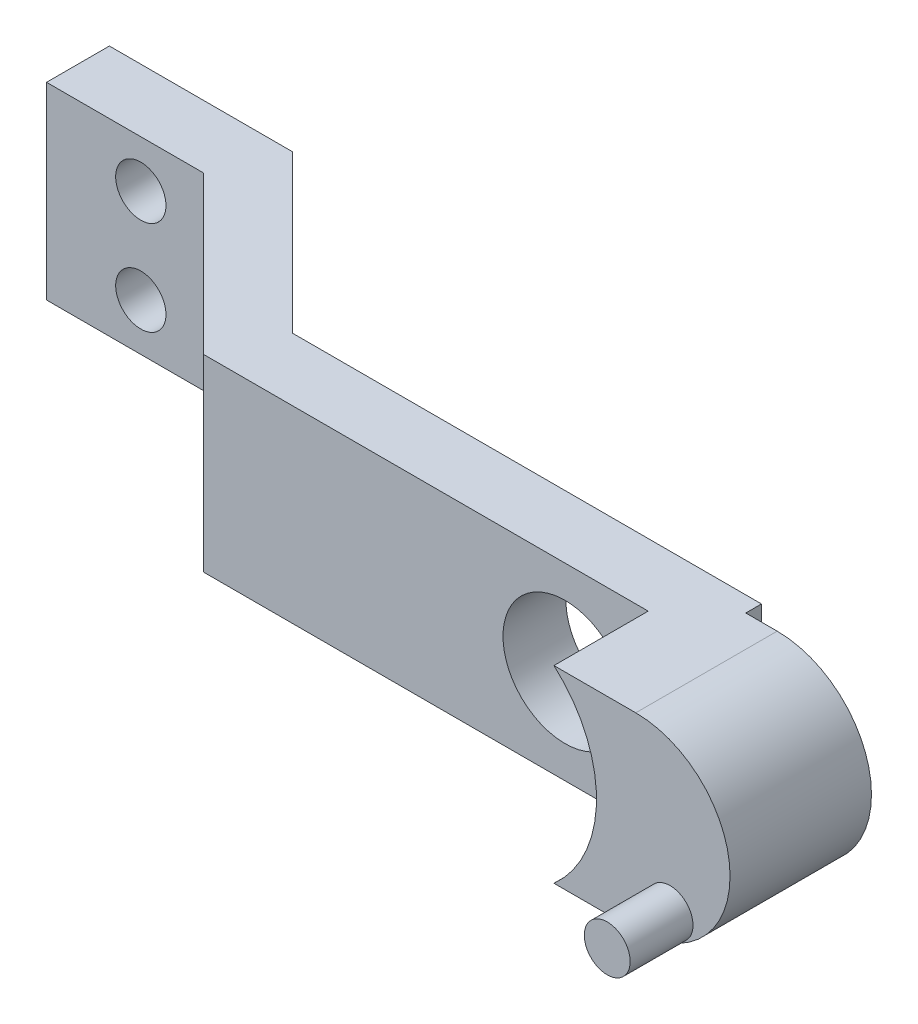
ISO-10303-21;
HEADER;
FILE_DESCRIPTION(('STEP AP214'),'2;1');
FILE_NAME('part.step','',(''),(''),'','','');
FILE_SCHEMA(('AUTOMOTIVE_DESIGN { 1 0 10303 214 1 1 1 1 }'));
ENDSEC;
DATA;
#1=APPLICATION_CONTEXT('core data for automotive mechanical design processes');
#2=APPLICATION_PROTOCOL_DEFINITION('international standard','automotive_design',2000,#1);
#3=PRODUCT_CONTEXT('',#1,'mechanical');
#4=PRODUCT('Part','Part','',(#3));
#5=PRODUCT_RELATED_PRODUCT_CATEGORY('part','',(#4));
#6=PRODUCT_DEFINITION_FORMATION('','',#4);
#7=PRODUCT_DEFINITION_CONTEXT('part definition',#1,'design');
#8=PRODUCT_DEFINITION('design','',#6,#7);
#9=PRODUCT_DEFINITION_SHAPE('','',#8);
#10=(LENGTH_UNIT() NAMED_UNIT(*) SI_UNIT(.MILLI.,.METRE.));
#11=(NAMED_UNIT(*) PLANE_ANGLE_UNIT() SI_UNIT($,.RADIAN.));
#12=(NAMED_UNIT(*) SI_UNIT($,.STERADIAN.) SOLID_ANGLE_UNIT());
#13=UNCERTAINTY_MEASURE_WITH_UNIT(LENGTH_MEASURE(1.E-05),#10,'distance_accuracy_value','');
#14=(GEOMETRIC_REPRESENTATION_CONTEXT(3) GLOBAL_UNCERTAINTY_ASSIGNED_CONTEXT((#13)) GLOBAL_UNIT_ASSIGNED_CONTEXT((#10,
#11,#12)) REPRESENTATION_CONTEXT('',''));
#15=CARTESIAN_POINT('',(0.,0.,0.));
#16=DIRECTION('',(0.,0.,1.));
#17=DIRECTION('',(1.,0.,0.));
#18=AXIS2_PLACEMENT_3D('',#15,#16,#17);
#19=CARTESIAN_POINT('',(0.,0.,4.));
#20=DIRECTION('',(0.,0.,1.));
#21=DIRECTION('',(1.,0.,0.));
#22=AXIS2_PLACEMENT_3D('',#19,#20,#21);
#23=PLANE('',#22);
#24=CARTESIAN_POINT('',(0.,0.,4.));
#25=DIRECTION('',(0.,0.,1.));
#26=DIRECTION('',(1.,0.,0.));
#27=AXIS2_PLACEMENT_3D('',#24,#25,#26);
#28=CIRCLE('',#27,3.95);
#29=CARTESIAN_POINT('',(3.95,0.,4.));
#30=VERTEX_POINT('',#29);
#31=EDGE_CURVE('E175',#30,#30,#28,.T.);
#32=ORIENTED_EDGE('',*,*,#31,.F.);
#33=EDGE_LOOP('',(#32));
#34=FACE_BOUND('',#33,.T.);
#35=CARTESIAN_POINT('',(0.,0.,4.));
#36=DIRECTION('',(0.,0.,-1.));
#37=DIRECTION('',(-1.,0.,0.));
#38=AXIS2_PLACEMENT_3D('',#35,#36,#37);
#39=CIRCLE('',#38,8.);
#40=CARTESIAN_POINT('',(5.29150262212918,6.,4.));
#41=VERTEX_POINT('',#40);
#42=CARTESIAN_POINT('',(5.29150262212918,-6.,4.));
#43=VERTEX_POINT('',#42);
#44=EDGE_CURVE('E69',#41,#43,#39,.T.);
#45=ORIENTED_EDGE('',*,*,#44,.F.);
#46=DIRECTION('',(-1.,0.,0.));
#47=VECTOR('',#46,1.);
#48=CARTESIAN_POINT('',(-23.,5.99999999999999,4.));
#49=LINE('',#48,#47);
#50=CARTESIAN_POINT('',(-23.,5.99999999999999,4.));
#51=VERTEX_POINT('',#50);
#52=EDGE_CURVE('E183',#41,#51,#49,.T.);
#53=ORIENTED_EDGE('',*,*,#52,.T.);
#54=DIRECTION('',(0.,-1.,0.));
#55=VECTOR('',#54,1.);
#56=CARTESIAN_POINT('',(-23.,5.99999999999999,4.));
#57=LINE('',#56,#55);
#58=CARTESIAN_POINT('',(-23.,-6.,4.));
#59=VERTEX_POINT('',#58);
#60=EDGE_CURVE('E167',#51,#59,#57,.T.);
#61=ORIENTED_EDGE('',*,*,#60,.T.);
#62=DIRECTION('',(1.,0.,0.));
#63=VECTOR('',#62,1.);
#64=CARTESIAN_POINT('',(-23.,-6.,4.));
#65=LINE('',#64,#63);
#66=EDGE_CURVE('E173',#59,#43,#65,.T.);
#67=ORIENTED_EDGE('',*,*,#66,.T.);
#68=EDGE_LOOP('',(#45,#53,#61,#67));
#69=FACE_BOUND('',#68,.T.);
#70=ADVANCED_FACE('F45',(#34,#69),#23,.T.);
#71=CARTESIAN_POINT('',(0.,0.,0.));
#72=DIRECTION('',(0.,0.,1.));
#73=DIRECTION('',(1.,0.,0.));
#74=AXIS2_PLACEMENT_3D('',#71,#72,#73);
#75=PLANE('',#74);
#76=DIRECTION('',(-1.,0.,0.));
#77=VECTOR('',#76,1.);
#78=CARTESIAN_POINT('',(-23.,5.99999999999999,0.));
#79=LINE('',#78,#77);
#80=CARTESIAN_POINT('',(8.5,6.,0.));
#81=VERTEX_POINT('',#80);
#82=CARTESIAN_POINT('',(-21.3431457505076,5.99999999999999,0.));
#83=VERTEX_POINT('',#82);
#84=EDGE_CURVE('E155',#81,#83,#79,.T.);
#85=ORIENTED_EDGE('',*,*,#84,.F.);
#86=DIRECTION('',(0.,-1.,0.));
#87=VECTOR('',#86,1.);
#88=CARTESIAN_POINT('',(8.5,6.,0.));
#89=LINE('',#88,#87);
#90=CARTESIAN_POINT('',(8.5,-6.,0.));
#91=VERTEX_POINT('',#90);
#92=EDGE_CURVE('E140',#81,#91,#89,.T.);
#93=ORIENTED_EDGE('',*,*,#92,.T.);
#94=DIRECTION('',(1.,0.,0.));
#95=VECTOR('',#94,1.);
#96=CARTESIAN_POINT('',(-23.,-6.,0.));
#97=LINE('',#96,#95);
#98=CARTESIAN_POINT('',(-21.3431457505076,-6.,0.));
#99=VERTEX_POINT('',#98);
#100=EDGE_CURVE('E168',#99,#91,#97,.T.);
#101=ORIENTED_EDGE('',*,*,#100,.F.);
#102=DIRECTION('',(0.,-1.,0.));
#103=VECTOR('',#102,1.);
#104=CARTESIAN_POINT('',(-21.3431457505076,31.7879688223744,0.));
#105=LINE('',#104,#103);
#106=EDGE_CURVE('E164',#83,#99,#105,.T.);
#107=ORIENTED_EDGE('',*,*,#106,.F.);
#108=EDGE_LOOP('',(#85,#93,#101,#107));
#109=FACE_BOUND('',#108,.T.);
#110=CARTESIAN_POINT('',(0.,0.,0.));
#111=DIRECTION('',(0.,0.,1.));
#112=DIRECTION('',(1.,0.,0.));
#113=AXIS2_PLACEMENT_3D('',#110,#111,#112);
#114=CIRCLE('',#113,3.95);
#115=CARTESIAN_POINT('',(3.95,0.,0.));
#116=VERTEX_POINT('',#115);
#117=EDGE_CURVE('E297',#116,#116,#114,.T.);
#118=ORIENTED_EDGE('',*,*,#117,.T.);
#119=EDGE_LOOP('',(#118));
#120=FACE_BOUND('',#119,.T.);
#121=ADVANCED_FACE('F161',(#109,#120),#75,.F.);
#122=CARTESIAN_POINT('',(-23.,-6.,4.));
#123=DIRECTION('',(0.,1.,0.));
#124=DIRECTION('',(0.,0.,1.));
#125=AXIS2_PLACEMENT_3D('',#122,#123,#124);
#126=PLANE('',#125);
#127=ORIENTED_EDGE('',*,*,#100,.T.);
#128=DIRECTION('',(0.,0.,-1.));
#129=VECTOR('',#128,1.);
#130=CARTESIAN_POINT('',(8.5,-6.,1.));
#131=LINE('',#130,#129);
#132=CARTESIAN_POINT('',(8.5,-6.,1.));
#133=VERTEX_POINT('',#132);
#134=EDGE_CURVE('E146',#133,#91,#131,.T.);
#135=ORIENTED_EDGE('',*,*,#134,.F.);
#136=DIRECTION('',(-1.,0.,0.));
#137=VECTOR('',#136,1.);
#138=CARTESIAN_POINT('',(8.5,-6.,1.));
#139=LINE('',#138,#137);
#140=CARTESIAN_POINT('',(10.5,-6.,1.));
#141=VERTEX_POINT('',#140);
#142=EDGE_CURVE('E159',#141,#133,#139,.T.);
#143=ORIENTED_EDGE('',*,*,#142,.F.);
#144=DIRECTION('',(0.,0.,-1.));
#145=VECTOR('',#144,1.);
#146=CARTESIAN_POINT('',(10.5,-6.,4.));
#147=LINE('',#146,#145);
#148=CARTESIAN_POINT('',(10.5000000000001,-6.,10.));
#149=VERTEX_POINT('',#148);
#150=EDGE_CURVE('E182',#141,#149,#147,.F.);
#151=ORIENTED_EDGE('',*,*,#150,.T.);
#152=DIRECTION('',(1.,0.,0.));
#153=VECTOR('',#152,1.);
#154=CARTESIAN_POINT('',(5.29150262212918,-6.,10.));
#155=LINE('',#154,#153);
#156=CARTESIAN_POINT('',(5.29150262212918,-6.,10.));
#157=VERTEX_POINT('',#156);
#158=EDGE_CURVE('E210',#157,#149,#155,.T.);
#159=ORIENTED_EDGE('',*,*,#158,.F.);
#160=DIRECTION('',(0.,0.,-1.));
#161=VECTOR('',#160,1.);
#162=CARTESIAN_POINT('',(5.29150262212918,-6.,10.));
#163=LINE('',#162,#161);
#164=EDGE_CURVE('E217',#157,#43,#163,.T.);
#165=ORIENTED_EDGE('',*,*,#164,.T.);
#166=ORIENTED_EDGE('',*,*,#66,.F.);
#167=DIRECTION('',(-0.707106781186546,0.,-0.707106781186549));
#168=VECTOR('',#167,1.);
#169=CARTESIAN_POINT('',(-23.,-6.,4.));
#170=LINE('',#169,#168);
#171=CARTESIAN_POINT('',(-33.,-6.,-6.));
#172=VERTEX_POINT('',#171);
#173=EDGE_CURVE('E236',#59,#172,#170,.T.);
#174=ORIENTED_EDGE('',*,*,#173,.T.);
#175=DIRECTION('',(-1.,0.,0.));
#176=VECTOR('',#175,1.);
#177=CARTESIAN_POINT('',(-33.,-6.,-6.));
#178=LINE('',#177,#176);
#179=CARTESIAN_POINT('',(-43.,-6.,-6.));
#180=VERTEX_POINT('',#179);
#181=EDGE_CURVE('E264',#172,#180,#178,.T.);
#182=ORIENTED_EDGE('',*,*,#181,.T.);
#183=DIRECTION('',(0.,0.,-1.));
#184=VECTOR('',#183,1.);
#185=CARTESIAN_POINT('',(-43.,-6.,-6.));
#186=LINE('',#185,#184);
#187=CARTESIAN_POINT('',(-43.,-6.,-10.));
#188=VERTEX_POINT('',#187);
#189=EDGE_CURVE('E268',#180,#188,#186,.T.);
#190=ORIENTED_EDGE('',*,*,#189,.T.);
#191=DIRECTION('',(1.,0.,0.));
#192=VECTOR('',#191,1.);
#193=CARTESIAN_POINT('',(-43.,-6.,-10.));
#194=LINE('',#193,#192);
#195=CARTESIAN_POINT('',(-31.3431457505076,-6.,-10.));
#196=VERTEX_POINT('',#195);
#197=EDGE_CURVE('E272',#188,#196,#194,.T.);
#198=ORIENTED_EDGE('',*,*,#197,.T.);
#199=DIRECTION('',(0.707106781186546,0.,0.707106781186549));
#200=VECTOR('',#199,1.);
#201=CARTESIAN_POINT('',(-31.3431457505076,-6.,-10.));
#202=LINE('',#201,#200);
#203=EDGE_CURVE('E276',#196,#99,#202,.T.);
#204=ORIENTED_EDGE('',*,*,#203,.T.);
#205=EDGE_LOOP('',(#127,#135,#143,#151,#159,#165,#166,#174,#182,#190,#198,#204));
#206=FACE_BOUND('',#205,.T.);
#207=ADVANCED_FACE('F208',(#206),#126,.F.);
#208=CARTESIAN_POINT('',(-23.,5.99999999999999,4.));
#209=DIRECTION('',(0.,-1.,0.));
#210=DIRECTION('',(1.,0.,0.));
#211=AXIS2_PLACEMENT_3D('',#208,#209,#210);
#212=PLANE('',#211);
#213=DIRECTION('',(-1.,0.,0.));
#214=VECTOR('',#213,1.);
#215=CARTESIAN_POINT('',(8.5,6.,1.));
#216=LINE('',#215,#214);
#217=CARTESIAN_POINT('',(10.5,6.,1.));
#218=VERTEX_POINT('',#217);
#219=CARTESIAN_POINT('',(8.5,6.,1.));
#220=VERTEX_POINT('',#219);
#221=EDGE_CURVE('E61',#218,#220,#216,.T.);
#222=ORIENTED_EDGE('',*,*,#221,.T.);
#223=DIRECTION('',(0.,0.,-1.));
#224=VECTOR('',#223,1.);
#225=CARTESIAN_POINT('',(8.5,6.,1.));
#226=LINE('',#225,#224);
#227=EDGE_CURVE('E144',#220,#81,#226,.T.);
#228=ORIENTED_EDGE('',*,*,#227,.T.);
#229=ORIENTED_EDGE('',*,*,#84,.T.);
#230=DIRECTION('',(-0.707106781186546,0.,-0.707106781186549));
#231=VECTOR('',#230,1.);
#232=CARTESIAN_POINT('',(-31.3431457505076,5.99999999999999,-10.));
#233=LINE('',#232,#231);
#234=CARTESIAN_POINT('',(-31.3431457505076,5.99999999999999,-10.));
#235=VERTEX_POINT('',#234);
#236=EDGE_CURVE('E257',#83,#235,#233,.T.);
#237=ORIENTED_EDGE('',*,*,#236,.T.);
#238=DIRECTION('',(-1.,0.,0.));
#239=VECTOR('',#238,1.);
#240=CARTESIAN_POINT('',(-43.,5.99999999999999,-10.));
#241=LINE('',#240,#239);
#242=CARTESIAN_POINT('',(-43.,5.99999999999999,-10.));
#243=VERTEX_POINT('',#242);
#244=EDGE_CURVE('E254',#235,#243,#241,.T.);
#245=ORIENTED_EDGE('',*,*,#244,.T.);
#246=DIRECTION('',(0.,0.,1.));
#247=VECTOR('',#246,1.);
#248=CARTESIAN_POINT('',(-43.,5.99999999999999,-6.));
#249=LINE('',#248,#247);
#250=CARTESIAN_POINT('',(-43.,5.99999999999999,-6.));
#251=VERTEX_POINT('',#250);
#252=EDGE_CURVE('E251',#243,#251,#249,.T.);
#253=ORIENTED_EDGE('',*,*,#252,.T.);
#254=DIRECTION('',(1.,0.,0.));
#255=VECTOR('',#254,1.);
#256=CARTESIAN_POINT('',(-33.,5.99999999999999,-6.));
#257=LINE('',#256,#255);
#258=CARTESIAN_POINT('',(-33.,5.99999999999999,-6.));
#259=VERTEX_POINT('',#258);
#260=EDGE_CURVE('E248',#251,#259,#257,.T.);
#261=ORIENTED_EDGE('',*,*,#260,.T.);
#262=DIRECTION('',(0.707106781186546,0.,0.707106781186549));
#263=VECTOR('',#262,1.);
#264=CARTESIAN_POINT('',(-23.,5.99999999999999,4.));
#265=LINE('',#264,#263);
#266=EDGE_CURVE('E260',#259,#51,#265,.T.);
#267=ORIENTED_EDGE('',*,*,#266,.T.);
#268=ORIENTED_EDGE('',*,*,#52,.F.);
#269=DIRECTION('',(0.,0.,-1.));
#270=VECTOR('',#269,1.);
#271=CARTESIAN_POINT('',(5.29150262212918,6.,10.));
#272=LINE('',#271,#270);
#273=CARTESIAN_POINT('',(5.29150262212918,6.,10.));
#274=VERTEX_POINT('',#273);
#275=EDGE_CURVE('E191',#274,#41,#272,.T.);
#276=ORIENTED_EDGE('',*,*,#275,.F.);
#277=DIRECTION('',(-1.,0.,0.));
#278=VECTOR('',#277,1.);
#279=CARTESIAN_POINT('',(10.5,6.,10.));
#280=LINE('',#279,#278);
#281=CARTESIAN_POINT('',(10.5,6.,10.));
#282=VERTEX_POINT('',#281);
#283=EDGE_CURVE('E222',#282,#274,#280,.T.);
#284=ORIENTED_EDGE('',*,*,#283,.F.);
#285=DIRECTION('',(0.,0.,-1.));
#286=VECTOR('',#285,1.);
#287=CARTESIAN_POINT('',(10.5,6.,4.));
#288=LINE('',#287,#286);
#289=EDGE_CURVE('E179',#282,#218,#288,.T.);
#290=ORIENTED_EDGE('',*,*,#289,.T.);
#291=EDGE_LOOP('',(#222,#228,#229,#237,#245,#253,#261,#267,#268,#276,#284,#290));
#292=FACE_BOUND('',#291,.T.);
#293=ADVANCED_FACE('F154',(#292),#212,.F.);
#294=CARTESIAN_POINT('',(0.,0.,4.));
#295=DIRECTION('',(0.,0.,-1.));
#296=DIRECTION('',(-1.,0.,0.));
#297=AXIS2_PLACEMENT_3D('',#294,#295,#296);
#298=CYLINDRICAL_SURFACE('',#297,3.95);
#299=ORIENTED_EDGE('',*,*,#31,.T.);
#300=EDGE_LOOP('',(#299));
#301=FACE_BOUND('',#300,.T.);
#302=ORIENTED_EDGE('',*,*,#117,.F.);
#303=EDGE_LOOP('',(#302));
#304=FACE_BOUND('',#303,.T.);
#305=ADVANCED_FACE('F373',(#301,#304),#298,.F.);
#306=CARTESIAN_POINT('',(-31.3431457505076,31.7879688223744,-10.));
#307=DIRECTION('',(0.707106781186549,0.,-0.707106781186546));
#308=DIRECTION('',(-0.707106781186546,0.,-0.707106781186549));
#309=AXIS2_PLACEMENT_3D('',#306,#307,#308);
#310=PLANE('',#309);
#311=ORIENTED_EDGE('',*,*,#236,.F.);
#312=ORIENTED_EDGE('',*,*,#106,.T.);
#313=ORIENTED_EDGE('',*,*,#203,.F.);
#314=DIRECTION('',(0.,-1.,0.));
#315=VECTOR('',#314,1.);
#316=CARTESIAN_POINT('',(-31.3431457505076,31.7879688223744,-10.));
#317=LINE('',#316,#315);
#318=EDGE_CURVE('E283',#235,#196,#317,.T.);
#319=ORIENTED_EDGE('',*,*,#318,.F.);
#320=EDGE_LOOP('',(#311,#312,#313,#319));
#321=FACE_BOUND('',#320,.T.);
#322=ADVANCED_FACE('F334',(#321),#310,.T.);
#323=CARTESIAN_POINT('',(-43.,31.7879688223744,-10.));
#324=DIRECTION('',(0.,0.,-1.));
#325=DIRECTION('',(-1.,0.,0.));
#326=AXIS2_PLACEMENT_3D('',#323,#324,#325);
#327=PLANE('',#326);
#328=CARTESIAN_POINT('',(-37.,2.99999999999999,-10.));
#329=DIRECTION('',(0.,0.,1.));
#330=DIRECTION('',(1.,0.,0.));
#331=AXIS2_PLACEMENT_3D('',#328,#329,#330);
#332=CIRCLE('',#331,1.6);
#333=CARTESIAN_POINT('',(-35.4,2.99999999999999,-10.));
#334=VERTEX_POINT('',#333);
#335=EDGE_CURVE('E232',#334,#334,#332,.T.);
#336=ORIENTED_EDGE('',*,*,#335,.T.);
#337=EDGE_LOOP('',(#336));
#338=FACE_BOUND('',#337,.T.);
#339=CARTESIAN_POINT('',(-37.,-3.00000000000001,-10.));
#340=DIRECTION('',(0.,0.,1.));
#341=DIRECTION('',(1.,0.,0.));
#342=AXIS2_PLACEMENT_3D('',#339,#340,#341);
#343=CIRCLE('',#342,1.6);
#344=CARTESIAN_POINT('',(-35.4,-3.00000000000001,-10.));
#345=VERTEX_POINT('',#344);
#346=EDGE_CURVE('E190',#345,#345,#343,.T.);
#347=ORIENTED_EDGE('',*,*,#346,.T.);
#348=EDGE_LOOP('',(#347));
#349=FACE_BOUND('',#348,.T.);
#350=ORIENTED_EDGE('',*,*,#244,.F.);
#351=ORIENTED_EDGE('',*,*,#318,.T.);
#352=ORIENTED_EDGE('',*,*,#197,.F.);
#353=DIRECTION('',(0.,-1.,0.));
#354=VECTOR('',#353,1.);
#355=CARTESIAN_POINT('',(-43.,31.7879688223744,-10.));
#356=LINE('',#355,#354);
#357=EDGE_CURVE('E286',#243,#188,#356,.T.);
#358=ORIENTED_EDGE('',*,*,#357,.F.);
#359=EDGE_LOOP('',(#350,#351,#352,#358));
#360=FACE_BOUND('',#359,.T.);
#361=ADVANCED_FACE('F340',(#338,#349,#360),#327,.T.);
#362=CARTESIAN_POINT('',(-43.,31.7879688223744,-6.));
#363=DIRECTION('',(-1.,0.,0.));
#364=DIRECTION('',(0.,0.,1.));
#365=AXIS2_PLACEMENT_3D('',#362,#363,#364);
#366=PLANE('',#365);
#367=ORIENTED_EDGE('',*,*,#252,.F.);
#368=ORIENTED_EDGE('',*,*,#357,.T.);
#369=ORIENTED_EDGE('',*,*,#189,.F.);
#370=DIRECTION('',(0.,-1.,0.));
#371=VECTOR('',#370,1.);
#372=CARTESIAN_POINT('',(-43.,31.7879688223744,-6.));
#373=LINE('',#372,#371);
#374=EDGE_CURVE('E289',#251,#180,#373,.T.);
#375=ORIENTED_EDGE('',*,*,#374,.F.);
#376=EDGE_LOOP('',(#367,#368,#369,#375));
#377=FACE_BOUND('',#376,.T.);
#378=ADVANCED_FACE('F344',(#377),#366,.T.);
#379=CARTESIAN_POINT('',(-33.,31.7879688223744,-6.));
#380=DIRECTION('',(0.,0.,1.));
#381=DIRECTION('',(1.,0.,0.));
#382=AXIS2_PLACEMENT_3D('',#379,#380,#381);
#383=PLANE('',#382);
#384=CARTESIAN_POINT('',(-37.,2.99999999999999,-6.));
#385=DIRECTION('',(0.,0.,1.));
#386=DIRECTION('',(1.,0.,0.));
#387=AXIS2_PLACEMENT_3D('',#384,#385,#386);
#388=CIRCLE('',#387,1.6);
#389=CARTESIAN_POINT('',(-35.4,2.99999999999999,-6.));
#390=VERTEX_POINT('',#389);
#391=EDGE_CURVE('E237',#390,#390,#388,.T.);
#392=ORIENTED_EDGE('',*,*,#391,.F.);
#393=EDGE_LOOP('',(#392));
#394=FACE_BOUND('',#393,.T.);
#395=CARTESIAN_POINT('',(-37.,-3.00000000000001,-6.));
#396=DIRECTION('',(0.,0.,1.));
#397=DIRECTION('',(1.,0.,0.));
#398=AXIS2_PLACEMENT_3D('',#395,#396,#397);
#399=CIRCLE('',#398,1.6);
#400=CARTESIAN_POINT('',(-35.4,-3.00000000000001,-6.));
#401=VERTEX_POINT('',#400);
#402=EDGE_CURVE('E241',#401,#401,#399,.T.);
#403=ORIENTED_EDGE('',*,*,#402,.F.);
#404=EDGE_LOOP('',(#403));
#405=FACE_BOUND('',#404,.T.);
#406=ORIENTED_EDGE('',*,*,#260,.F.);
#407=ORIENTED_EDGE('',*,*,#374,.T.);
#408=ORIENTED_EDGE('',*,*,#181,.F.);
#409=DIRECTION('',(0.,-1.,0.));
#410=VECTOR('',#409,1.);
#411=CARTESIAN_POINT('',(-33.,31.7879688223744,-6.));
#412=LINE('',#411,#410);
#413=EDGE_CURVE('E280',#259,#172,#412,.T.);
#414=ORIENTED_EDGE('',*,*,#413,.F.);
#415=EDGE_LOOP('',(#406,#407,#408,#414));
#416=FACE_BOUND('',#415,.T.);
#417=ADVANCED_FACE('F347',(#394,#405,#416),#383,.T.);
#418=CARTESIAN_POINT('',(-23.,31.7879688223744,4.));
#419=DIRECTION('',(-0.707106781186549,0.,0.707106781186546));
#420=DIRECTION('',(0.707106781186546,0.,0.707106781186549));
#421=AXIS2_PLACEMENT_3D('',#418,#419,#420);
#422=PLANE('',#421);
#423=ORIENTED_EDGE('',*,*,#266,.F.);
#424=ORIENTED_EDGE('',*,*,#413,.T.);
#425=ORIENTED_EDGE('',*,*,#173,.F.);
#426=ORIENTED_EDGE('',*,*,#60,.F.);
#427=EDGE_LOOP('',(#423,#424,#425,#426));
#428=FACE_BOUND('',#427,.T.);
#429=ADVANCED_FACE('F313',(#428),#422,.T.);
#430=CARTESIAN_POINT('',(-37.,-3.00000000000001,-10.));
#431=DIRECTION('',(0.,0.,1.));
#432=DIRECTION('',(1.,0.,0.));
#433=AXIS2_PLACEMENT_3D('',#430,#431,#432);
#434=CYLINDRICAL_SURFACE('',#433,1.6);
#435=ORIENTED_EDGE('',*,*,#346,.F.);
#436=EDGE_LOOP('',(#435));
#437=FACE_BOUND('',#436,.T.);
#438=ORIENTED_EDGE('',*,*,#402,.T.);
#439=EDGE_LOOP('',(#438));
#440=FACE_BOUND('',#439,.T.);
#441=ADVANCED_FACE('F356',(#437,#440),#434,.F.);
#442=CARTESIAN_POINT('',(-37.,2.99999999999999,-10.));
#443=DIRECTION('',(0.,0.,1.));
#444=DIRECTION('',(1.,0.,0.));
#445=AXIS2_PLACEMENT_3D('',#442,#443,#444);
#446=CYLINDRICAL_SURFACE('',#445,1.6);
#447=ORIENTED_EDGE('',*,*,#335,.F.);
#448=EDGE_LOOP('',(#447));
#449=FACE_BOUND('',#448,.T.);
#450=ORIENTED_EDGE('',*,*,#391,.T.);
#451=EDGE_LOOP('',(#450));
#452=FACE_BOUND('',#451,.T.);
#453=ADVANCED_FACE('F395',(#449,#452),#446,.F.);
#454=CARTESIAN_POINT('',(10.5,0.,4.));
#455=DIRECTION('',(0.,0.,-1.));
#456=DIRECTION('',(-1.,0.,0.));
#457=AXIS2_PLACEMENT_3D('',#454,#455,#456);
#458=CYLINDRICAL_SURFACE('',#457,6.);
#459=CARTESIAN_POINT('',(10.5,0.,1.));
#460=DIRECTION('',(0.,0.,1.));
#461=DIRECTION('',(1.,0.,0.));
#462=AXIS2_PLACEMENT_3D('',#459,#460,#461);
#463=CIRCLE('',#462,6.);
#464=CARTESIAN_POINT('',(16.5,0.,1.));
#465=VERTEX_POINT('',#464);
#466=EDGE_CURVE('E11',#465,#141,#463,.F.);
#467=ORIENTED_EDGE('',*,*,#466,.F.);
#468=DIRECTION('',(0.,0.,-1.));
#469=VECTOR('',#468,1.);
#470=CARTESIAN_POINT('',(16.5,0.,4.));
#471=LINE('',#470,#469);
#472=CARTESIAN_POINT('',(16.5,0.,4.));
#473=VERTEX_POINT('',#472);
#474=EDGE_CURVE('E187',#473,#465,#471,.T.);
#475=ORIENTED_EDGE('',*,*,#474,.F.);
#476=ORIENTED_EDGE('',*,*,#474,.T.);
#477=EDGE_CURVE('E49',#218,#465,#463,.F.);
#478=ORIENTED_EDGE('',*,*,#477,.F.);
#479=ORIENTED_EDGE('',*,*,#289,.F.);
#480=CARTESIAN_POINT('',(10.5,0.,10.));
#481=DIRECTION('',(0.,0.,1.));
#482=DIRECTION('',(-1.,0.,0.));
#483=AXIS2_PLACEMENT_3D('',#480,#481,#482);
#484=CIRCLE('',#483,6.);
#485=EDGE_CURVE('E204',#149,#282,#484,.T.);
#486=ORIENTED_EDGE('',*,*,#485,.F.);
#487=ORIENTED_EDGE('',*,*,#150,.F.);
#488=EDGE_LOOP('',(#467,#475,#476,#478,#479,#486,#487));
#489=FACE_BOUND('',#488,.T.);
#490=ADVANCED_FACE('F47',(#489),#458,.T.);
#491=CARTESIAN_POINT('',(0.,0.,10.));
#492=DIRECTION('',(0.,0.,-1.));
#493=DIRECTION('',(-1.,0.,0.));
#494=AXIS2_PLACEMENT_3D('',#491,#492,#493);
#495=CYLINDRICAL_SURFACE('',#494,8.);
#496=ORIENTED_EDGE('',*,*,#44,.T.);
#497=ORIENTED_EDGE('',*,*,#164,.F.);
#498=CARTESIAN_POINT('',(0.,0.,10.));
#499=DIRECTION('',(0.,0.,-1.));
#500=DIRECTION('',(-1.,0.,0.));
#501=AXIS2_PLACEMENT_3D('',#498,#499,#500);
#502=CIRCLE('',#501,8.);
#503=EDGE_CURVE('E214',#274,#157,#502,.T.);
#504=ORIENTED_EDGE('',*,*,#503,.F.);
#505=ORIENTED_EDGE('',*,*,#275,.T.);
#506=EDGE_LOOP('',(#496,#497,#504,#505));
#507=FACE_BOUND('',#506,.T.);
#508=ADVANCED_FACE('F316',(#507),#495,.F.);
#509=CARTESIAN_POINT('',(10.5,0.,10.));
#510=DIRECTION('',(0.,0.,-1.));
#511=DIRECTION('',(-1.,0.,0.));
#512=AXIS2_PLACEMENT_3D('',#509,#510,#511);
#513=PLANE('',#512);
#514=CARTESIAN_POINT('',(12.6831777931538,-3.89281901648664,10.));
#515=DIRECTION('',(0.,0.,-1.));
#516=DIRECTION('',(-1.,0.,0.));
#517=AXIS2_PLACEMENT_3D('',#514,#515,#516);
#518=CIRCLE('',#517,1.46);
#519=CARTESIAN_POINT('',(11.2231777931538,-3.89281901648664,10.));
#520=VERTEX_POINT('',#519);
#521=EDGE_CURVE('E186',#520,#520,#518,.F.);
#522=ORIENTED_EDGE('',*,*,#521,.F.);
#523=EDGE_LOOP('',(#522));
#524=FACE_BOUND('',#523,.T.);
#525=ORIENTED_EDGE('',*,*,#485,.T.);
#526=ORIENTED_EDGE('',*,*,#283,.T.);
#527=ORIENTED_EDGE('',*,*,#503,.T.);
#528=ORIENTED_EDGE('',*,*,#158,.T.);
#529=EDGE_LOOP('',(#525,#526,#527,#528));
#530=FACE_BOUND('',#529,.T.);
#531=ADVANCED_FACE('F212',(#524,#530),#513,.F.);
#532=CARTESIAN_POINT('',(12.6831777931538,-3.89281901648664,14.));
#533=DIRECTION('',(0.,0.,-1.));
#534=DIRECTION('',(-1.,0.,0.));
#535=AXIS2_PLACEMENT_3D('',#532,#533,#534);
#536=CYLINDRICAL_SURFACE('',#535,1.46);
#537=CARTESIAN_POINT('',(12.6831777931538,-3.89281901648664,14.));
#538=DIRECTION('',(0.,0.,1.));
#539=DIRECTION('',(1.,0.,0.));
#540=AXIS2_PLACEMENT_3D('',#537,#538,#539);
#541=CIRCLE('',#540,1.46);
#542=CARTESIAN_POINT('',(14.1431777931538,-3.89281901648664,14.));
#543=VERTEX_POINT('',#542);
#544=EDGE_CURVE('E227',#543,#543,#541,.T.);
#545=ORIENTED_EDGE('',*,*,#544,.F.);
#546=EDGE_LOOP('',(#545));
#547=FACE_BOUND('',#546,.T.);
#548=ORIENTED_EDGE('',*,*,#521,.T.);
#549=EDGE_LOOP('',(#548));
#550=FACE_BOUND('',#549,.T.);
#551=ADVANCED_FACE('F419',(#547,#550),#536,.T.);
#552=CARTESIAN_POINT('',(12.6831777931538,-3.89281901648664,14.));
#553=DIRECTION('',(0.,0.,1.));
#554=DIRECTION('',(1.,0.,0.));
#555=AXIS2_PLACEMENT_3D('',#552,#553,#554);
#556=PLANE('',#555);
#557=ORIENTED_EDGE('',*,*,#544,.T.);
#558=EDGE_LOOP('',(#557));
#559=FACE_BOUND('',#558,.T.);
#560=ADVANCED_FACE('F402',(#559),#556,.T.);
#561=CARTESIAN_POINT('',(8.5,6.,1.));
#562=DIRECTION('',(-1.,0.,0.));
#563=DIRECTION('',(0.,0.,1.));
#564=AXIS2_PLACEMENT_3D('',#561,#562,#563);
#565=PLANE('',#564);
#566=ORIENTED_EDGE('',*,*,#134,.T.);
#567=ORIENTED_EDGE('',*,*,#92,.F.);
#568=ORIENTED_EDGE('',*,*,#227,.F.);
#569=DIRECTION('',(0.,-1.,0.));
#570=VECTOR('',#569,1.);
#571=CARTESIAN_POINT('',(8.5,6.,1.));
#572=LINE('',#571,#570);
#573=EDGE_CURVE('E151',#220,#133,#572,.T.);
#574=ORIENTED_EDGE('',*,*,#573,.T.);
#575=EDGE_LOOP('',(#566,#567,#568,#574));
#576=FACE_BOUND('',#575,.T.);
#577=ADVANCED_FACE('F142',(#576),#565,.F.);
#578=CARTESIAN_POINT('',(8.5,6.,1.));
#579=DIRECTION('',(0.,0.,1.));
#580=DIRECTION('',(1.,0.,0.));
#581=AXIS2_PLACEMENT_3D('',#578,#579,#580);
#582=PLANE('',#581);
#583=ORIENTED_EDGE('',*,*,#466,.T.);
#584=ORIENTED_EDGE('',*,*,#142,.T.);
#585=ORIENTED_EDGE('',*,*,#573,.F.);
#586=ORIENTED_EDGE('',*,*,#221,.F.);
#587=ORIENTED_EDGE('',*,*,#477,.T.);
#588=EDGE_LOOP('',(#583,#584,#585,#586,#587));
#589=FACE_BOUND('',#588,.T.);
#590=ADVANCED_FACE('F198',(#589),#582,.F.);
#591=CLOSED_SHELL('',(#70,#121,#207,#293,#305,#322,#361,#378,#417,#429,#441,#453,#490,#508,#531,
#551,#560,#577,#590));
#592=MANIFOLD_SOLID_BREP('B2',#591);
#593=ADVANCED_BREP_SHAPE_REPRESENTATION('',(#18,#592),#14);
#594=SHAPE_DEFINITION_REPRESENTATION(#9,#593);
ENDSEC;
END-ISO-10303-21;
